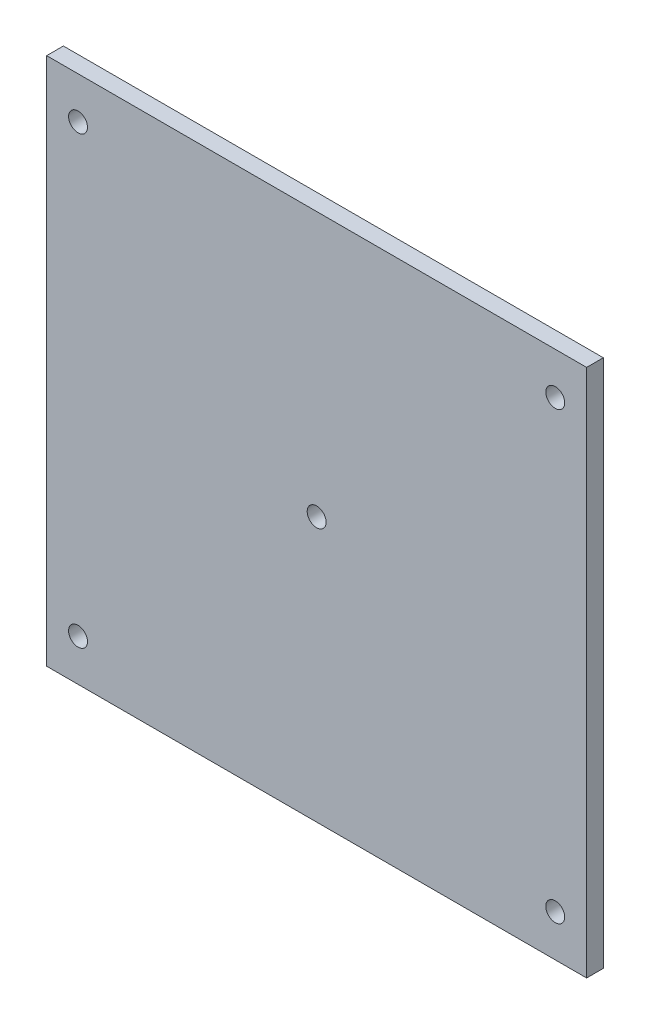
ISO-10303-21;
HEADER;
FILE_DESCRIPTION(('STEP AP214'),'2;1');
FILE_NAME('part.step','',(''),(''),'','','');
FILE_SCHEMA(('AUTOMOTIVE_DESIGN { 1 0 10303 214 1 1 1 1 }'));
ENDSEC;
DATA;
#1=APPLICATION_CONTEXT('core data for automotive mechanical design processes');
#2=APPLICATION_PROTOCOL_DEFINITION('international standard','automotive_design',2000,#1);
#3=PRODUCT_CONTEXT('',#1,'mechanical');
#4=PRODUCT('Part','Part','',(#3));
#5=PRODUCT_RELATED_PRODUCT_CATEGORY('part','',(#4));
#6=PRODUCT_DEFINITION_FORMATION('','',#4);
#7=PRODUCT_DEFINITION_CONTEXT('part definition',#1,'design');
#8=PRODUCT_DEFINITION('design','',#6,#7);
#9=PRODUCT_DEFINITION_SHAPE('','',#8);
#10=(LENGTH_UNIT() NAMED_UNIT(*) SI_UNIT(.MILLI.,.METRE.));
#11=(NAMED_UNIT(*) PLANE_ANGLE_UNIT() SI_UNIT($,.RADIAN.));
#12=(NAMED_UNIT(*) SI_UNIT($,.STERADIAN.) SOLID_ANGLE_UNIT());
#13=UNCERTAINTY_MEASURE_WITH_UNIT(LENGTH_MEASURE(1.E-05),#10,'distance_accuracy_value','');
#14=(GEOMETRIC_REPRESENTATION_CONTEXT(3) GLOBAL_UNCERTAINTY_ASSIGNED_CONTEXT((#13)) GLOBAL_UNIT_ASSIGNED_CONTEXT((#10,
#11,#12)) REPRESENTATION_CONTEXT('',''));
#15=CARTESIAN_POINT('',(0.,0.,0.));
#16=DIRECTION('',(0.,0.,1.));
#17=DIRECTION('',(1.,0.,0.));
#18=AXIS2_PLACEMENT_3D('',#15,#16,#17);
#19=CARTESIAN_POINT('',(0.,0.,3.));
#20=DIRECTION('',(1.,0.,0.));
#21=DIRECTION('',(0.,0.,-1.));
#22=AXIS2_PLACEMENT_3D('',#19,#20,#21);
#23=PLANE('',#22);
#24=DIRECTION('',(0.,-1.,0.));
#25=VECTOR('',#24,1.);
#26=CARTESIAN_POINT('',(0.,0.,0.));
#27=LINE('',#26,#25);
#28=CARTESIAN_POINT('',(0.,95.,0.));
#29=VERTEX_POINT('',#28);
#30=CARTESIAN_POINT('',(0.,0.,0.));
#31=VERTEX_POINT('',#30);
#32=EDGE_CURVE('E107',#29,#31,#27,.T.);
#33=ORIENTED_EDGE('',*,*,#32,.T.);
#34=DIRECTION('',(0.,0.,-1.));
#35=VECTOR('',#34,1.);
#36=CARTESIAN_POINT('',(0.,0.,3.));
#37=LINE('',#36,#35);
#38=CARTESIAN_POINT('',(0.,0.,3.));
#39=VERTEX_POINT('',#38);
#40=EDGE_CURVE('E11',#39,#31,#37,.T.);
#41=ORIENTED_EDGE('',*,*,#40,.F.);
#42=DIRECTION('',(0.,-1.,0.));
#43=VECTOR('',#42,1.);
#44=CARTESIAN_POINT('',(0.,0.,3.));
#45=LINE('',#44,#43);
#46=CARTESIAN_POINT('',(0.,95.,3.));
#47=VERTEX_POINT('',#46);
#48=EDGE_CURVE('E94',#47,#39,#45,.T.);
#49=ORIENTED_EDGE('',*,*,#48,.F.);
#50=DIRECTION('',(0.,0.,-1.));
#51=VECTOR('',#50,1.);
#52=CARTESIAN_POINT('',(0.,95.,3.));
#53=LINE('',#52,#51);
#54=EDGE_CURVE('E103',#47,#29,#53,.T.);
#55=ORIENTED_EDGE('',*,*,#54,.T.);
#56=EDGE_LOOP('',(#33,#41,#49,#55));
#57=FACE_BOUND('',#56,.T.);
#58=ADVANCED_FACE('F41',(#57),#23,.F.);
#59=CARTESIAN_POINT('',(0.,0.,3.));
#60=DIRECTION('',(0.,1.,0.));
#61=DIRECTION('',(0.,0.,1.));
#62=AXIS2_PLACEMENT_3D('',#59,#60,#61);
#63=PLANE('',#62);
#64=DIRECTION('',(1.,0.,0.));
#65=VECTOR('',#64,1.);
#66=CARTESIAN_POINT('',(0.,0.,0.));
#67=LINE('',#66,#65);
#68=CARTESIAN_POINT('',(97.,0.,0.));
#69=VERTEX_POINT('',#68);
#70=EDGE_CURVE('E98',#31,#69,#67,.T.);
#71=ORIENTED_EDGE('',*,*,#70,.T.);
#72=DIRECTION('',(0.,0.,-1.));
#73=VECTOR('',#72,1.);
#74=CARTESIAN_POINT('',(97.,0.,3.));
#75=LINE('',#74,#73);
#76=CARTESIAN_POINT('',(97.,0.,3.));
#77=VERTEX_POINT('',#76);
#78=EDGE_CURVE('E50',#77,#69,#75,.T.);
#79=ORIENTED_EDGE('',*,*,#78,.F.);
#80=DIRECTION('',(1.,0.,0.));
#81=VECTOR('',#80,1.);
#82=CARTESIAN_POINT('',(0.,0.,3.));
#83=LINE('',#82,#81);
#84=EDGE_CURVE('E89',#39,#77,#83,.T.);
#85=ORIENTED_EDGE('',*,*,#84,.F.);
#86=ORIENTED_EDGE('',*,*,#40,.T.);
#87=EDGE_LOOP('',(#71,#79,#85,#86));
#88=FACE_BOUND('',#87,.T.);
#89=ADVANCED_FACE('F97',(#88),#63,.F.);
#90=CARTESIAN_POINT('',(97.,0.,3.));
#91=DIRECTION('',(-1.,0.,0.));
#92=DIRECTION('',(0.,0.,1.));
#93=AXIS2_PLACEMENT_3D('',#90,#91,#92);
#94=PLANE('',#93);
#95=DIRECTION('',(0.,1.,0.));
#96=VECTOR('',#95,1.);
#97=CARTESIAN_POINT('',(97.,0.,0.));
#98=LINE('',#97,#96);
#99=CARTESIAN_POINT('',(97.,95.,0.));
#100=VERTEX_POINT('',#99);
#101=EDGE_CURVE('E76',#69,#100,#98,.T.);
#102=ORIENTED_EDGE('',*,*,#101,.T.);
#103=DIRECTION('',(0.,0.,-1.));
#104=VECTOR('',#103,1.);
#105=CARTESIAN_POINT('',(97.,95.,3.));
#106=LINE('',#105,#104);
#107=CARTESIAN_POINT('',(97.,95.,3.));
#108=VERTEX_POINT('',#107);
#109=EDGE_CURVE('E99',#108,#100,#106,.T.);
#110=ORIENTED_EDGE('',*,*,#109,.F.);
#111=DIRECTION('',(0.,1.,0.));
#112=VECTOR('',#111,1.);
#113=CARTESIAN_POINT('',(97.,0.,3.));
#114=LINE('',#113,#112);
#115=EDGE_CURVE('E92',#77,#108,#114,.T.);
#116=ORIENTED_EDGE('',*,*,#115,.F.);
#117=ORIENTED_EDGE('',*,*,#78,.T.);
#118=EDGE_LOOP('',(#102,#110,#116,#117));
#119=FACE_BOUND('',#118,.T.);
#120=ADVANCED_FACE('F101',(#119),#94,.F.);
#121=CARTESIAN_POINT('',(0.,95.,3.));
#122=DIRECTION('',(0.,-1.,0.));
#123=DIRECTION('',(0.,0.,-1.));
#124=AXIS2_PLACEMENT_3D('',#121,#122,#123);
#125=PLANE('',#124);
#126=DIRECTION('',(-1.,0.,0.));
#127=VECTOR('',#126,1.);
#128=CARTESIAN_POINT('',(0.,95.,0.));
#129=LINE('',#128,#127);
#130=EDGE_CURVE('E82',#100,#29,#129,.T.);
#131=ORIENTED_EDGE('',*,*,#130,.T.);
#132=ORIENTED_EDGE('',*,*,#54,.F.);
#133=DIRECTION('',(-1.,0.,0.));
#134=VECTOR('',#133,1.);
#135=CARTESIAN_POINT('',(0.,95.,3.));
#136=LINE('',#135,#134);
#137=EDGE_CURVE('E59',#108,#47,#136,.T.);
#138=ORIENTED_EDGE('',*,*,#137,.F.);
#139=ORIENTED_EDGE('',*,*,#109,.T.);
#140=EDGE_LOOP('',(#131,#132,#138,#139));
#141=FACE_BOUND('',#140,.T.);
#142=ADVANCED_FACE('F148',(#141),#125,.F.);
#143=CARTESIAN_POINT('',(0.,0.,3.));
#144=DIRECTION('',(0.,0.,-1.));
#145=DIRECTION('',(-1.,0.,0.));
#146=AXIS2_PLACEMENT_3D('',#143,#144,#145);
#147=PLANE('',#146);
#148=CARTESIAN_POINT('',(91.365,7.495,3.));
#149=DIRECTION('',(0.,0.,1.));
#150=DIRECTION('',(1.,0.,0.));
#151=AXIS2_PLACEMENT_3D('',#148,#149,#150);
#152=CIRCLE('',#151,1.69999999999999);
#153=CARTESIAN_POINT('',(93.065,7.495,3.));
#154=VERTEX_POINT('',#153);
#155=EDGE_CURVE('E240',#154,#154,#152,.T.);
#156=ORIENTED_EDGE('',*,*,#155,.F.);
#157=EDGE_LOOP('',(#156));
#158=FACE_BOUND('',#157,.T.);
#159=CARTESIAN_POINT('',(5.635,87.505,3.));
#160=DIRECTION('',(0.,0.,1.));
#161=DIRECTION('',(1.,0.,0.));
#162=AXIS2_PLACEMENT_3D('',#159,#160,#161);
#163=CIRCLE('',#162,1.7);
#164=CARTESIAN_POINT('',(7.335,87.505,3.));
#165=VERTEX_POINT('',#164);
#166=EDGE_CURVE('E238',#165,#165,#163,.T.);
#167=ORIENTED_EDGE('',*,*,#166,.F.);
#168=EDGE_LOOP('',(#167));
#169=FACE_BOUND('',#168,.T.);
#170=CARTESIAN_POINT('',(91.365,87.505,3.));
#171=DIRECTION('',(0.,0.,1.));
#172=DIRECTION('',(1.,0.,0.));
#173=AXIS2_PLACEMENT_3D('',#170,#171,#172);
#174=CIRCLE('',#173,1.69999999999999);
#175=CARTESIAN_POINT('',(93.065,87.505,3.));
#176=VERTEX_POINT('',#175);
#177=EDGE_CURVE('E241',#176,#176,#174,.T.);
#178=ORIENTED_EDGE('',*,*,#177,.F.);
#179=EDGE_LOOP('',(#178));
#180=FACE_BOUND('',#179,.T.);
#181=CARTESIAN_POINT('',(48.5,47.5,3.));
#182=DIRECTION('',(0.,0.,1.));
#183=DIRECTION('',(1.,0.,0.));
#184=AXIS2_PLACEMENT_3D('',#181,#182,#183);
#185=CIRCLE('',#184,1.7);
#186=CARTESIAN_POINT('',(50.2,47.5,3.));
#187=VERTEX_POINT('',#186);
#188=EDGE_CURVE('E246',#187,#187,#185,.T.);
#189=ORIENTED_EDGE('',*,*,#188,.F.);
#190=EDGE_LOOP('',(#189));
#191=FACE_BOUND('',#190,.T.);
#192=CARTESIAN_POINT('',(5.635,7.495,3.));
#193=DIRECTION('',(0.,0.,1.));
#194=DIRECTION('',(1.,0.,0.));
#195=AXIS2_PLACEMENT_3D('',#192,#193,#194);
#196=CIRCLE('',#195,1.7);
#197=CARTESIAN_POINT('',(7.335,7.495,3.));
#198=VERTEX_POINT('',#197);
#199=EDGE_CURVE('E119',#198,#198,#196,.T.);
#200=ORIENTED_EDGE('',*,*,#199,.F.);
#201=EDGE_LOOP('',(#200));
#202=FACE_BOUND('',#201,.T.);
#203=ORIENTED_EDGE('',*,*,#48,.T.);
#204=ORIENTED_EDGE('',*,*,#84,.T.);
#205=ORIENTED_EDGE('',*,*,#115,.T.);
#206=ORIENTED_EDGE('',*,*,#137,.T.);
#207=EDGE_LOOP('',(#203,#204,#205,#206));
#208=FACE_BOUND('',#207,.T.);
#209=ADVANCED_FACE('F90',(#158,#169,#180,#191,#202,#208),#147,.F.);
#210=CARTESIAN_POINT('',(0.,0.,0.));
#211=DIRECTION('',(0.,0.,-1.));
#212=DIRECTION('',(-1.,0.,0.));
#213=AXIS2_PLACEMENT_3D('',#210,#211,#212);
#214=PLANE('',#213);
#215=CARTESIAN_POINT('',(91.365,7.495,0.));
#216=DIRECTION('',(0.,0.,-1.));
#217=DIRECTION('',(-1.,0.,0.));
#218=AXIS2_PLACEMENT_3D('',#215,#216,#217);
#219=CIRCLE('',#218,1.69999999999999);
#220=CARTESIAN_POINT('',(93.065,7.495,0.));
#221=VERTEX_POINT('',#220);
#222=EDGE_CURVE('E44',#221,#221,#219,.T.);
#223=ORIENTED_EDGE('',*,*,#222,.F.);
#224=EDGE_LOOP('',(#223));
#225=FACE_BOUND('',#224,.T.);
#226=CARTESIAN_POINT('',(5.635,87.505,0.));
#227=DIRECTION('',(0.,0.,-1.));
#228=DIRECTION('',(-1.,0.,0.));
#229=AXIS2_PLACEMENT_3D('',#226,#227,#228);
#230=CIRCLE('',#229,1.7);
#231=CARTESIAN_POINT('',(7.335,87.505,0.));
#232=VERTEX_POINT('',#231);
#233=EDGE_CURVE('E124',#232,#232,#230,.T.);
#234=ORIENTED_EDGE('',*,*,#233,.F.);
#235=EDGE_LOOP('',(#234));
#236=FACE_BOUND('',#235,.T.);
#237=CARTESIAN_POINT('',(91.365,87.505,0.));
#238=DIRECTION('',(0.,0.,-1.));
#239=DIRECTION('',(-1.,0.,0.));
#240=AXIS2_PLACEMENT_3D('',#237,#238,#239);
#241=CIRCLE('',#240,1.69999999999999);
#242=CARTESIAN_POINT('',(93.065,87.505,0.));
#243=VERTEX_POINT('',#242);
#244=EDGE_CURVE('E122',#243,#243,#241,.T.);
#245=ORIENTED_EDGE('',*,*,#244,.F.);
#246=EDGE_LOOP('',(#245));
#247=FACE_BOUND('',#246,.T.);
#248=CARTESIAN_POINT('',(48.5,47.5,0.));
#249=DIRECTION('',(0.,0.,-1.));
#250=DIRECTION('',(-1.,0.,0.));
#251=AXIS2_PLACEMENT_3D('',#248,#249,#250);
#252=CIRCLE('',#251,1.7);
#253=CARTESIAN_POINT('',(50.2,47.5,0.));
#254=VERTEX_POINT('',#253);
#255=EDGE_CURVE('E118',#254,#254,#252,.T.);
#256=ORIENTED_EDGE('',*,*,#255,.F.);
#257=EDGE_LOOP('',(#256));
#258=FACE_BOUND('',#257,.T.);
#259=CARTESIAN_POINT('',(5.635,7.495,0.));
#260=DIRECTION('',(0.,0.,-1.));
#261=DIRECTION('',(-1.,0.,0.));
#262=AXIS2_PLACEMENT_3D('',#259,#260,#261);
#263=CIRCLE('',#262,1.7);
#264=CARTESIAN_POINT('',(7.335,7.495,0.));
#265=VERTEX_POINT('',#264);
#266=EDGE_CURVE('E115',#265,#265,#263,.T.);
#267=ORIENTED_EDGE('',*,*,#266,.F.);
#268=EDGE_LOOP('',(#267));
#269=FACE_BOUND('',#268,.T.);
#270=ORIENTED_EDGE('',*,*,#32,.F.);
#271=ORIENTED_EDGE('',*,*,#130,.F.);
#272=ORIENTED_EDGE('',*,*,#101,.F.);
#273=ORIENTED_EDGE('',*,*,#70,.F.);
#274=EDGE_LOOP('',(#270,#271,#272,#273));
#275=FACE_BOUND('',#274,.T.);
#276=ADVANCED_FACE('F134',(#225,#236,#247,#258,#269,#275),#214,.T.);
#277=CARTESIAN_POINT('',(5.635,7.495,-1.2E-05));
#278=DIRECTION('',(0.,0.,1.));
#279=DIRECTION('',(1.,0.,0.));
#280=AXIS2_PLACEMENT_3D('',#277,#278,#279);
#281=CYLINDRICAL_SURFACE('',#280,1.7);
#282=CARTESIAN_POINT('',(7.335,7.495,0.));
#283=CARTESIAN_POINT('',(7.335,7.495,0.03125));
#284=CARTESIAN_POINT('',(7.335,7.495,0.0625));
#285=CARTESIAN_POINT('',(7.335,7.495,0.125));
#286=CARTESIAN_POINT('',(7.335,7.495,0.15625));
#287=CARTESIAN_POINT('',(7.335,7.495,0.21875));
#288=CARTESIAN_POINT('',(7.335,7.495,0.25));
#289=CARTESIAN_POINT('',(7.335,7.495,0.3125));
#290=CARTESIAN_POINT('',(7.335,7.495,0.34375));
#291=CARTESIAN_POINT('',(7.335,7.495,0.40625));
#292=CARTESIAN_POINT('',(7.335,7.495,0.4375));
#293=CARTESIAN_POINT('',(7.335,7.495,0.5));
#294=CARTESIAN_POINT('',(7.335,7.495,0.53125));
#295=CARTESIAN_POINT('',(7.335,7.495,0.59375));
#296=CARTESIAN_POINT('',(7.335,7.495,0.625));
#297=CARTESIAN_POINT('',(7.335,7.495,0.6875));
#298=CARTESIAN_POINT('',(7.335,7.495,0.71875));
#299=CARTESIAN_POINT('',(7.335,7.495,0.78125));
#300=CARTESIAN_POINT('',(7.335,7.495,0.8125));
#301=CARTESIAN_POINT('',(7.335,7.495,0.875));
#302=CARTESIAN_POINT('',(7.335,7.495,0.90625));
#303=CARTESIAN_POINT('',(7.335,7.495,0.96875));
#304=CARTESIAN_POINT('',(7.335,7.495,1.));
#305=CARTESIAN_POINT('',(7.335,7.495,1.0625));
#306=CARTESIAN_POINT('',(7.335,7.495,1.09375));
#307=CARTESIAN_POINT('',(7.335,7.495,1.15625));
#308=CARTESIAN_POINT('',(7.335,7.495,1.1875));
#309=CARTESIAN_POINT('',(7.335,7.495,1.25));
#310=CARTESIAN_POINT('',(7.335,7.495,1.28125));
#311=CARTESIAN_POINT('',(7.335,7.495,1.34375));
#312=CARTESIAN_POINT('',(7.335,7.495,1.375));
#313=CARTESIAN_POINT('',(7.335,7.495,1.4375));
#314=CARTESIAN_POINT('',(7.335,7.495,1.46875));
#315=CARTESIAN_POINT('',(7.335,7.495,1.53125));
#316=CARTESIAN_POINT('',(7.335,7.495,1.5625));
#317=CARTESIAN_POINT('',(7.335,7.495,1.625));
#318=CARTESIAN_POINT('',(7.335,7.495,1.65625));
#319=CARTESIAN_POINT('',(7.335,7.495,1.71875));
#320=CARTESIAN_POINT('',(7.335,7.495,1.75));
#321=CARTESIAN_POINT('',(7.335,7.495,1.8125));
#322=CARTESIAN_POINT('',(7.335,7.495,1.84375));
#323=CARTESIAN_POINT('',(7.335,7.495,1.90625));
#324=CARTESIAN_POINT('',(7.335,7.495,1.9375));
#325=CARTESIAN_POINT('',(7.335,7.495,2.));
#326=CARTESIAN_POINT('',(7.335,7.495,2.03125));
#327=CARTESIAN_POINT('',(7.335,7.495,2.09375));
#328=CARTESIAN_POINT('',(7.335,7.495,2.125));
#329=CARTESIAN_POINT('',(7.335,7.495,2.1875));
#330=CARTESIAN_POINT('',(7.335,7.495,2.21875));
#331=CARTESIAN_POINT('',(7.335,7.495,2.28125));
#332=CARTESIAN_POINT('',(7.335,7.495,2.3125));
#333=CARTESIAN_POINT('',(7.335,7.495,2.375));
#334=CARTESIAN_POINT('',(7.335,7.495,2.40625));
#335=CARTESIAN_POINT('',(7.335,7.495,2.46875));
#336=CARTESIAN_POINT('',(7.335,7.495,2.5));
#337=CARTESIAN_POINT('',(7.335,7.495,2.5625));
#338=CARTESIAN_POINT('',(7.335,7.495,2.59375));
#339=CARTESIAN_POINT('',(7.335,7.495,2.65625));
#340=CARTESIAN_POINT('',(7.335,7.495,2.6875));
#341=CARTESIAN_POINT('',(7.335,7.495,2.75));
#342=CARTESIAN_POINT('',(7.335,7.495,2.78125));
#343=CARTESIAN_POINT('',(7.335,7.495,2.84375));
#344=CARTESIAN_POINT('',(7.335,7.495,2.875));
#345=CARTESIAN_POINT('',(7.335,7.495,2.9375));
#346=CARTESIAN_POINT('',(7.335,7.495,2.96875));
#347=CARTESIAN_POINT('',(7.335,7.495,3.));
#348=B_SPLINE_CURVE_WITH_KNOTS('',3,(#282,#283,#284,#285,#286,#287,#288,#289,#290,#291,#292,
#293,#294,#295,#296,#297,#298,#299,#300,#301,#302,#303,#304,#305,#306,#307,#308,#309,#310,#311,
#312,#313,#314,#315,#316,#317,#318,#319,#320,#321,#322,#323,#324,#325,#326,#327,#328,#329,#330,
#331,#332,#333,#334,#335,#336,#337,#338,#339,#340,#341,#342,#343,#344,#345,#346,#347),
.UNSPECIFIED.,.F.,.F.,(4,2,2,2,2,2,2,2,2,2,2,2,2,2,2,2,2,2,2,2,2,2,2,2,2,2,2,2,2,2,2,2,4),(0.,
0.09375,0.1875,0.28125,0.375,0.46875,0.5625,0.65625,0.75,0.84375,0.9375,1.03125,1.125,1.21875,
1.3125,1.40625,1.5,1.59375,1.6875,1.78125,1.875,1.96875,2.0625,2.15625,2.25,2.34375,2.4375,
2.53125,2.625,2.71875,2.8125,2.90625,3.),.UNSPECIFIED.);
#349=EDGE_CURVE('BSEAM137',#265,#198,#348,.T.);
#350=ORIENTED_EDGE('',*,*,#266,.T.);
#351=ORIENTED_EDGE('',*,*,#199,.T.);
#352=ORIENTED_EDGE('',*,*,#349,.T.);
#353=ORIENTED_EDGE('',*,*,#349,.F.);
#354=EDGE_LOOP('',(#350,#352,#351,#353));
#355=FACE_BOUND('',#354,.T.);
#356=ADVANCED_FACE('F137',(#355),#281,.F.);
#357=CARTESIAN_POINT('',(48.5,47.5,-1.2E-05));
#358=DIRECTION('',(0.,0.,1.));
#359=DIRECTION('',(1.,0.,0.));
#360=AXIS2_PLACEMENT_3D('',#357,#358,#359);
#361=CYLINDRICAL_SURFACE('',#360,1.7);
#362=CARTESIAN_POINT('',(50.2,47.5,0.));
#363=CARTESIAN_POINT('',(50.2,47.5,0.03125));
#364=CARTESIAN_POINT('',(50.2,47.5,0.0625));
#365=CARTESIAN_POINT('',(50.2,47.5,0.125));
#366=CARTESIAN_POINT('',(50.2,47.5,0.15625));
#367=CARTESIAN_POINT('',(50.2,47.5,0.21875));
#368=CARTESIAN_POINT('',(50.2,47.5,0.25));
#369=CARTESIAN_POINT('',(50.2,47.5,0.3125));
#370=CARTESIAN_POINT('',(50.2,47.5,0.34375));
#371=CARTESIAN_POINT('',(50.2,47.5,0.40625));
#372=CARTESIAN_POINT('',(50.2,47.5,0.4375));
#373=CARTESIAN_POINT('',(50.2,47.5,0.5));
#374=CARTESIAN_POINT('',(50.2,47.5,0.53125));
#375=CARTESIAN_POINT('',(50.2,47.5,0.59375));
#376=CARTESIAN_POINT('',(50.2,47.5,0.625));
#377=CARTESIAN_POINT('',(50.2,47.5,0.6875));
#378=CARTESIAN_POINT('',(50.2,47.5,0.71875));
#379=CARTESIAN_POINT('',(50.2,47.5,0.78125));
#380=CARTESIAN_POINT('',(50.2,47.5,0.8125));
#381=CARTESIAN_POINT('',(50.2,47.5,0.875));
#382=CARTESIAN_POINT('',(50.2,47.5,0.90625));
#383=CARTESIAN_POINT('',(50.2,47.5,0.96875));
#384=CARTESIAN_POINT('',(50.2,47.5,1.));
#385=CARTESIAN_POINT('',(50.2,47.5,1.0625));
#386=CARTESIAN_POINT('',(50.2,47.5,1.09375));
#387=CARTESIAN_POINT('',(50.2,47.5,1.15625));
#388=CARTESIAN_POINT('',(50.2,47.5,1.1875));
#389=CARTESIAN_POINT('',(50.2,47.5,1.25));
#390=CARTESIAN_POINT('',(50.2,47.5,1.28125));
#391=CARTESIAN_POINT('',(50.2,47.5,1.34375));
#392=CARTESIAN_POINT('',(50.2,47.5,1.375));
#393=CARTESIAN_POINT('',(50.2,47.5,1.4375));
#394=CARTESIAN_POINT('',(50.2,47.5,1.46875));
#395=CARTESIAN_POINT('',(50.2,47.5,1.53125));
#396=CARTESIAN_POINT('',(50.2,47.5,1.5625));
#397=CARTESIAN_POINT('',(50.2,47.5,1.625));
#398=CARTESIAN_POINT('',(50.2,47.5,1.65625));
#399=CARTESIAN_POINT('',(50.2,47.5,1.71875));
#400=CARTESIAN_POINT('',(50.2,47.5,1.75));
#401=CARTESIAN_POINT('',(50.2,47.5,1.8125));
#402=CARTESIAN_POINT('',(50.2,47.5,1.84375));
#403=CARTESIAN_POINT('',(50.2,47.5,1.90625));
#404=CARTESIAN_POINT('',(50.2,47.5,1.9375));
#405=CARTESIAN_POINT('',(50.2,47.5,2.));
#406=CARTESIAN_POINT('',(50.2,47.5,2.03125));
#407=CARTESIAN_POINT('',(50.2,47.5,2.09375));
#408=CARTESIAN_POINT('',(50.2,47.5,2.125));
#409=CARTESIAN_POINT('',(50.2,47.5,2.1875));
#410=CARTESIAN_POINT('',(50.2,47.5,2.21875));
#411=CARTESIAN_POINT('',(50.2,47.5,2.28125));
#412=CARTESIAN_POINT('',(50.2,47.5,2.3125));
#413=CARTESIAN_POINT('',(50.2,47.5,2.375));
#414=CARTESIAN_POINT('',(50.2,47.5,2.40625));
#415=CARTESIAN_POINT('',(50.2,47.5,2.46875));
#416=CARTESIAN_POINT('',(50.2,47.5,2.5));
#417=CARTESIAN_POINT('',(50.2,47.5,2.5625));
#418=CARTESIAN_POINT('',(50.2,47.5,2.59375));
#419=CARTESIAN_POINT('',(50.2,47.5,2.65625));
#420=CARTESIAN_POINT('',(50.2,47.5,2.6875));
#421=CARTESIAN_POINT('',(50.2,47.5,2.75));
#422=CARTESIAN_POINT('',(50.2,47.5,2.78125));
#423=CARTESIAN_POINT('',(50.2,47.5,2.84375));
#424=CARTESIAN_POINT('',(50.2,47.5,2.875));
#425=CARTESIAN_POINT('',(50.2,47.5,2.9375));
#426=CARTESIAN_POINT('',(50.2,47.5,2.96875));
#427=CARTESIAN_POINT('',(50.2,47.5,3.));
#428=B_SPLINE_CURVE_WITH_KNOTS('',3,(#362,#363,#364,#365,#366,#367,#368,#369,#370,#371,#372,
#373,#374,#375,#376,#377,#378,#379,#380,#381,#382,#383,#384,#385,#386,#387,#388,#389,#390,#391,
#392,#393,#394,#395,#396,#397,#398,#399,#400,#401,#402,#403,#404,#405,#406,#407,#408,#409,#410,
#411,#412,#413,#414,#415,#416,#417,#418,#419,#420,#421,#422,#423,#424,#425,#426,#427),
.UNSPECIFIED.,.F.,.F.,(4,2,2,2,2,2,2,2,2,2,2,2,2,2,2,2,2,2,2,2,2,2,2,2,2,2,2,2,2,2,2,2,4),(0.,
0.09375,0.1875,0.28125,0.375,0.46875,0.5625,0.65625,0.75,0.84375,0.9375,1.03125,1.125,1.21875,
1.3125,1.40625,1.5,1.59375,1.6875,1.78125,1.875,1.96875,2.0625,2.15625,2.25,2.34375,2.4375,
2.53125,2.625,2.71875,2.8125,2.90625,3.),.UNSPECIFIED.);
#429=EDGE_CURVE('BSEAM195',#254,#187,#428,.T.);
#430=ORIENTED_EDGE('',*,*,#255,.T.);
#431=ORIENTED_EDGE('',*,*,#188,.T.);
#432=ORIENTED_EDGE('',*,*,#429,.T.);
#433=ORIENTED_EDGE('',*,*,#429,.F.);
#434=EDGE_LOOP('',(#430,#432,#431,#433));
#435=FACE_BOUND('',#434,.T.);
#436=ADVANCED_FACE('F195',(#435),#361,.F.);
#437=CARTESIAN_POINT('',(91.365,87.505,-1.2E-05));
#438=DIRECTION('',(0.,0.,1.));
#439=DIRECTION('',(1.,0.,0.));
#440=AXIS2_PLACEMENT_3D('',#437,#438,#439);
#441=CYLINDRICAL_SURFACE('',#440,1.69999999999999);
#442=CARTESIAN_POINT('',(93.065,87.505,0.));
#443=CARTESIAN_POINT('',(93.065,87.505,0.03125));
#444=CARTESIAN_POINT('',(93.065,87.505,0.0625));
#445=CARTESIAN_POINT('',(93.065,87.505,0.125));
#446=CARTESIAN_POINT('',(93.065,87.505,0.15625));
#447=CARTESIAN_POINT('',(93.065,87.505,0.21875));
#448=CARTESIAN_POINT('',(93.065,87.505,0.25));
#449=CARTESIAN_POINT('',(93.065,87.505,0.3125));
#450=CARTESIAN_POINT('',(93.065,87.505,0.34375));
#451=CARTESIAN_POINT('',(93.065,87.505,0.40625));
#452=CARTESIAN_POINT('',(93.065,87.505,0.4375));
#453=CARTESIAN_POINT('',(93.065,87.505,0.5));
#454=CARTESIAN_POINT('',(93.065,87.505,0.53125));
#455=CARTESIAN_POINT('',(93.065,87.505,0.59375));
#456=CARTESIAN_POINT('',(93.065,87.505,0.625));
#457=CARTESIAN_POINT('',(93.065,87.505,0.6875));
#458=CARTESIAN_POINT('',(93.065,87.505,0.71875));
#459=CARTESIAN_POINT('',(93.065,87.505,0.78125));
#460=CARTESIAN_POINT('',(93.065,87.505,0.8125));
#461=CARTESIAN_POINT('',(93.065,87.505,0.875));
#462=CARTESIAN_POINT('',(93.065,87.505,0.90625));
#463=CARTESIAN_POINT('',(93.065,87.505,0.96875));
#464=CARTESIAN_POINT('',(93.065,87.505,1.));
#465=CARTESIAN_POINT('',(93.065,87.505,1.0625));
#466=CARTESIAN_POINT('',(93.065,87.505,1.09375));
#467=CARTESIAN_POINT('',(93.065,87.505,1.15625));
#468=CARTESIAN_POINT('',(93.065,87.505,1.1875));
#469=CARTESIAN_POINT('',(93.065,87.505,1.25));
#470=CARTESIAN_POINT('',(93.065,87.505,1.28125));
#471=CARTESIAN_POINT('',(93.065,87.505,1.34375));
#472=CARTESIAN_POINT('',(93.065,87.505,1.375));
#473=CARTESIAN_POINT('',(93.065,87.505,1.4375));
#474=CARTESIAN_POINT('',(93.065,87.505,1.46875));
#475=CARTESIAN_POINT('',(93.065,87.505,1.53125));
#476=CARTESIAN_POINT('',(93.065,87.505,1.5625));
#477=CARTESIAN_POINT('',(93.065,87.505,1.625));
#478=CARTESIAN_POINT('',(93.065,87.505,1.65625));
#479=CARTESIAN_POINT('',(93.065,87.505,1.71875));
#480=CARTESIAN_POINT('',(93.065,87.505,1.75));
#481=CARTESIAN_POINT('',(93.065,87.505,1.8125));
#482=CARTESIAN_POINT('',(93.065,87.505,1.84375));
#483=CARTESIAN_POINT('',(93.065,87.505,1.90625));
#484=CARTESIAN_POINT('',(93.065,87.505,1.9375));
#485=CARTESIAN_POINT('',(93.065,87.505,2.));
#486=CARTESIAN_POINT('',(93.065,87.505,2.03125));
#487=CARTESIAN_POINT('',(93.065,87.505,2.09375));
#488=CARTESIAN_POINT('',(93.065,87.505,2.125));
#489=CARTESIAN_POINT('',(93.065,87.505,2.1875));
#490=CARTESIAN_POINT('',(93.065,87.505,2.21875));
#491=CARTESIAN_POINT('',(93.065,87.505,2.28125));
#492=CARTESIAN_POINT('',(93.065,87.505,2.3125));
#493=CARTESIAN_POINT('',(93.065,87.505,2.375));
#494=CARTESIAN_POINT('',(93.065,87.505,2.40625));
#495=CARTESIAN_POINT('',(93.065,87.505,2.46875));
#496=CARTESIAN_POINT('',(93.065,87.505,2.5));
#497=CARTESIAN_POINT('',(93.065,87.505,2.5625));
#498=CARTESIAN_POINT('',(93.065,87.505,2.59375));
#499=CARTESIAN_POINT('',(93.065,87.505,2.65625));
#500=CARTESIAN_POINT('',(93.065,87.505,2.6875));
#501=CARTESIAN_POINT('',(93.065,87.505,2.75));
#502=CARTESIAN_POINT('',(93.065,87.505,2.78125));
#503=CARTESIAN_POINT('',(93.065,87.505,2.84375));
#504=CARTESIAN_POINT('',(93.065,87.505,2.875));
#505=CARTESIAN_POINT('',(93.065,87.505,2.9375));
#506=CARTESIAN_POINT('',(93.065,87.505,2.96875));
#507=CARTESIAN_POINT('',(93.065,87.505,3.));
#508=B_SPLINE_CURVE_WITH_KNOTS('',3,(#442,#443,#444,#445,#446,#447,#448,#449,#450,#451,#452,
#453,#454,#455,#456,#457,#458,#459,#460,#461,#462,#463,#464,#465,#466,#467,#468,#469,#470,#471,
#472,#473,#474,#475,#476,#477,#478,#479,#480,#481,#482,#483,#484,#485,#486,#487,#488,#489,#490,
#491,#492,#493,#494,#495,#496,#497,#498,#499,#500,#501,#502,#503,#504,#505,#506,#507),
.UNSPECIFIED.,.F.,.F.,(4,2,2,2,2,2,2,2,2,2,2,2,2,2,2,2,2,2,2,2,2,2,2,2,2,2,2,2,2,2,2,2,4),(0.,
0.09375,0.1875,0.28125,0.375,0.46875,0.5625,0.65625,0.75,0.84375,0.9375,1.03125,1.125,1.21875,
1.3125,1.40625,1.5,1.59375,1.6875,1.78125,1.875,1.96875,2.0625,2.15625,2.25,2.34375,2.4375,
2.53125,2.625,2.71875,2.8125,2.90625,3.),.UNSPECIFIED.);
#509=EDGE_CURVE('BSEAM205',#243,#176,#508,.T.);
#510=ORIENTED_EDGE('',*,*,#244,.T.);
#511=ORIENTED_EDGE('',*,*,#177,.T.);
#512=ORIENTED_EDGE('',*,*,#509,.T.);
#513=ORIENTED_EDGE('',*,*,#509,.F.);
#514=EDGE_LOOP('',(#510,#512,#511,#513));
#515=FACE_BOUND('',#514,.T.);
#516=ADVANCED_FACE('F205',(#515),#441,.F.);
#517=CARTESIAN_POINT('',(5.635,87.505,-1.2E-05));
#518=DIRECTION('',(0.,0.,1.));
#519=DIRECTION('',(1.,0.,0.));
#520=AXIS2_PLACEMENT_3D('',#517,#518,#519);
#521=CYLINDRICAL_SURFACE('',#520,1.7);
#522=CARTESIAN_POINT('',(7.335,87.505,0.));
#523=CARTESIAN_POINT('',(7.335,87.505,0.03125));
#524=CARTESIAN_POINT('',(7.335,87.505,0.0625));
#525=CARTESIAN_POINT('',(7.335,87.505,0.125));
#526=CARTESIAN_POINT('',(7.335,87.505,0.15625));
#527=CARTESIAN_POINT('',(7.335,87.505,0.21875));
#528=CARTESIAN_POINT('',(7.335,87.505,0.25));
#529=CARTESIAN_POINT('',(7.335,87.505,0.3125));
#530=CARTESIAN_POINT('',(7.335,87.505,0.34375));
#531=CARTESIAN_POINT('',(7.335,87.505,0.40625));
#532=CARTESIAN_POINT('',(7.335,87.505,0.4375));
#533=CARTESIAN_POINT('',(7.335,87.505,0.5));
#534=CARTESIAN_POINT('',(7.335,87.505,0.53125));
#535=CARTESIAN_POINT('',(7.335,87.505,0.59375));
#536=CARTESIAN_POINT('',(7.335,87.505,0.625));
#537=CARTESIAN_POINT('',(7.335,87.505,0.6875));
#538=CARTESIAN_POINT('',(7.335,87.505,0.71875));
#539=CARTESIAN_POINT('',(7.335,87.505,0.78125));
#540=CARTESIAN_POINT('',(7.335,87.505,0.8125));
#541=CARTESIAN_POINT('',(7.335,87.505,0.875));
#542=CARTESIAN_POINT('',(7.335,87.505,0.90625));
#543=CARTESIAN_POINT('',(7.335,87.505,0.96875));
#544=CARTESIAN_POINT('',(7.335,87.505,1.));
#545=CARTESIAN_POINT('',(7.335,87.505,1.0625));
#546=CARTESIAN_POINT('',(7.335,87.505,1.09375));
#547=CARTESIAN_POINT('',(7.335,87.505,1.15625));
#548=CARTESIAN_POINT('',(7.335,87.505,1.1875));
#549=CARTESIAN_POINT('',(7.335,87.505,1.25));
#550=CARTESIAN_POINT('',(7.335,87.505,1.28125));
#551=CARTESIAN_POINT('',(7.335,87.505,1.34375));
#552=CARTESIAN_POINT('',(7.335,87.505,1.375));
#553=CARTESIAN_POINT('',(7.335,87.505,1.4375));
#554=CARTESIAN_POINT('',(7.335,87.505,1.46875));
#555=CARTESIAN_POINT('',(7.335,87.505,1.53125));
#556=CARTESIAN_POINT('',(7.335,87.505,1.5625));
#557=CARTESIAN_POINT('',(7.335,87.505,1.625));
#558=CARTESIAN_POINT('',(7.335,87.505,1.65625));
#559=CARTESIAN_POINT('',(7.335,87.505,1.71875));
#560=CARTESIAN_POINT('',(7.335,87.505,1.75));
#561=CARTESIAN_POINT('',(7.335,87.505,1.8125));
#562=CARTESIAN_POINT('',(7.335,87.505,1.84375));
#563=CARTESIAN_POINT('',(7.335,87.505,1.90625));
#564=CARTESIAN_POINT('',(7.335,87.505,1.9375));
#565=CARTESIAN_POINT('',(7.335,87.505,2.));
#566=CARTESIAN_POINT('',(7.335,87.505,2.03125));
#567=CARTESIAN_POINT('',(7.335,87.505,2.09375));
#568=CARTESIAN_POINT('',(7.335,87.505,2.125));
#569=CARTESIAN_POINT('',(7.335,87.505,2.1875));
#570=CARTESIAN_POINT('',(7.335,87.505,2.21875));
#571=CARTESIAN_POINT('',(7.335,87.505,2.28125));
#572=CARTESIAN_POINT('',(7.335,87.505,2.3125));
#573=CARTESIAN_POINT('',(7.335,87.505,2.375));
#574=CARTESIAN_POINT('',(7.335,87.505,2.40625));
#575=CARTESIAN_POINT('',(7.335,87.505,2.46875));
#576=CARTESIAN_POINT('',(7.335,87.505,2.5));
#577=CARTESIAN_POINT('',(7.335,87.505,2.5625));
#578=CARTESIAN_POINT('',(7.335,87.505,2.59375));
#579=CARTESIAN_POINT('',(7.335,87.505,2.65625));
#580=CARTESIAN_POINT('',(7.335,87.505,2.6875));
#581=CARTESIAN_POINT('',(7.335,87.505,2.75));
#582=CARTESIAN_POINT('',(7.335,87.505,2.78125));
#583=CARTESIAN_POINT('',(7.335,87.505,2.84375));
#584=CARTESIAN_POINT('',(7.335,87.505,2.875));
#585=CARTESIAN_POINT('',(7.335,87.505,2.9375));
#586=CARTESIAN_POINT('',(7.335,87.505,2.96875));
#587=CARTESIAN_POINT('',(7.335,87.505,3.));
#588=B_SPLINE_CURVE_WITH_KNOTS('',3,(#522,#523,#524,#525,#526,#527,#528,#529,#530,#531,#532,
#533,#534,#535,#536,#537,#538,#539,#540,#541,#542,#543,#544,#545,#546,#547,#548,#549,#550,#551,
#552,#553,#554,#555,#556,#557,#558,#559,#560,#561,#562,#563,#564,#565,#566,#567,#568,#569,#570,
#571,#572,#573,#574,#575,#576,#577,#578,#579,#580,#581,#582,#583,#584,#585,#586,#587),
.UNSPECIFIED.,.F.,.F.,(4,2,2,2,2,2,2,2,2,2,2,2,2,2,2,2,2,2,2,2,2,2,2,2,2,2,2,2,2,2,2,2,4),(0.,
0.09375,0.1875,0.28125,0.375,0.46875,0.5625,0.65625,0.75,0.84375,0.9375,1.03125,1.125,1.21875,
1.3125,1.40625,1.5,1.59375,1.6875,1.78125,1.875,1.96875,2.0625,2.15625,2.25,2.34375,2.4375,
2.53125,2.625,2.71875,2.8125,2.90625,3.),.UNSPECIFIED.);
#589=EDGE_CURVE('BSEAM215',#232,#165,#588,.T.);
#590=ORIENTED_EDGE('',*,*,#233,.T.);
#591=ORIENTED_EDGE('',*,*,#166,.T.);
#592=ORIENTED_EDGE('',*,*,#589,.T.);
#593=ORIENTED_EDGE('',*,*,#589,.F.);
#594=EDGE_LOOP('',(#590,#592,#591,#593));
#595=FACE_BOUND('',#594,.T.);
#596=ADVANCED_FACE('F215',(#595),#521,.F.);
#597=CARTESIAN_POINT('',(91.365,7.495,-1.2E-05));
#598=DIRECTION('',(0.,0.,1.));
#599=DIRECTION('',(1.,0.,0.));
#600=AXIS2_PLACEMENT_3D('',#597,#598,#599);
#601=CYLINDRICAL_SURFACE('',#600,1.69999999999999);
#602=CARTESIAN_POINT('',(93.065,7.495,0.));
#603=CARTESIAN_POINT('',(93.065,7.495,0.03125));
#604=CARTESIAN_POINT('',(93.065,7.495,0.0625));
#605=CARTESIAN_POINT('',(93.065,7.495,0.125));
#606=CARTESIAN_POINT('',(93.065,7.495,0.15625));
#607=CARTESIAN_POINT('',(93.065,7.495,0.21875));
#608=CARTESIAN_POINT('',(93.065,7.495,0.25));
#609=CARTESIAN_POINT('',(93.065,7.495,0.3125));
#610=CARTESIAN_POINT('',(93.065,7.495,0.34375));
#611=CARTESIAN_POINT('',(93.065,7.495,0.40625));
#612=CARTESIAN_POINT('',(93.065,7.495,0.4375));
#613=CARTESIAN_POINT('',(93.065,7.495,0.5));
#614=CARTESIAN_POINT('',(93.065,7.495,0.53125));
#615=CARTESIAN_POINT('',(93.065,7.495,0.59375));
#616=CARTESIAN_POINT('',(93.065,7.495,0.625));
#617=CARTESIAN_POINT('',(93.065,7.495,0.6875));
#618=CARTESIAN_POINT('',(93.065,7.495,0.71875));
#619=CARTESIAN_POINT('',(93.065,7.495,0.78125));
#620=CARTESIAN_POINT('',(93.065,7.495,0.8125));
#621=CARTESIAN_POINT('',(93.065,7.495,0.875));
#622=CARTESIAN_POINT('',(93.065,7.495,0.90625));
#623=CARTESIAN_POINT('',(93.065,7.495,0.96875));
#624=CARTESIAN_POINT('',(93.065,7.495,1.));
#625=CARTESIAN_POINT('',(93.065,7.495,1.0625));
#626=CARTESIAN_POINT('',(93.065,7.495,1.09375));
#627=CARTESIAN_POINT('',(93.065,7.495,1.15625));
#628=CARTESIAN_POINT('',(93.065,7.495,1.1875));
#629=CARTESIAN_POINT('',(93.065,7.495,1.25));
#630=CARTESIAN_POINT('',(93.065,7.495,1.28125));
#631=CARTESIAN_POINT('',(93.065,7.495,1.34375));
#632=CARTESIAN_POINT('',(93.065,7.495,1.375));
#633=CARTESIAN_POINT('',(93.065,7.495,1.4375));
#634=CARTESIAN_POINT('',(93.065,7.495,1.46875));
#635=CARTESIAN_POINT('',(93.065,7.495,1.53125));
#636=CARTESIAN_POINT('',(93.065,7.495,1.5625));
#637=CARTESIAN_POINT('',(93.065,7.495,1.625));
#638=CARTESIAN_POINT('',(93.065,7.495,1.65625));
#639=CARTESIAN_POINT('',(93.065,7.495,1.71875));
#640=CARTESIAN_POINT('',(93.065,7.495,1.75));
#641=CARTESIAN_POINT('',(93.065,7.495,1.8125));
#642=CARTESIAN_POINT('',(93.065,7.495,1.84375));
#643=CARTESIAN_POINT('',(93.065,7.495,1.90625));
#644=CARTESIAN_POINT('',(93.065,7.495,1.9375));
#645=CARTESIAN_POINT('',(93.065,7.495,2.));
#646=CARTESIAN_POINT('',(93.065,7.495,2.03125));
#647=CARTESIAN_POINT('',(93.065,7.495,2.09375));
#648=CARTESIAN_POINT('',(93.065,7.495,2.125));
#649=CARTESIAN_POINT('',(93.065,7.495,2.1875));
#650=CARTESIAN_POINT('',(93.065,7.495,2.21875));
#651=CARTESIAN_POINT('',(93.065,7.495,2.28125));
#652=CARTESIAN_POINT('',(93.065,7.495,2.3125));
#653=CARTESIAN_POINT('',(93.065,7.495,2.375));
#654=CARTESIAN_POINT('',(93.065,7.495,2.40625));
#655=CARTESIAN_POINT('',(93.065,7.495,2.46875));
#656=CARTESIAN_POINT('',(93.065,7.495,2.5));
#657=CARTESIAN_POINT('',(93.065,7.495,2.5625));
#658=CARTESIAN_POINT('',(93.065,7.495,2.59375));
#659=CARTESIAN_POINT('',(93.065,7.495,2.65625));
#660=CARTESIAN_POINT('',(93.065,7.495,2.6875));
#661=CARTESIAN_POINT('',(93.065,7.495,2.75));
#662=CARTESIAN_POINT('',(93.065,7.495,2.78125));
#663=CARTESIAN_POINT('',(93.065,7.495,2.84375));
#664=CARTESIAN_POINT('',(93.065,7.495,2.875));
#665=CARTESIAN_POINT('',(93.065,7.495,2.9375));
#666=CARTESIAN_POINT('',(93.065,7.495,2.96875));
#667=CARTESIAN_POINT('',(93.065,7.495,3.));
#668=B_SPLINE_CURVE_WITH_KNOTS('',3,(#602,#603,#604,#605,#606,#607,#608,#609,#610,#611,#612,
#613,#614,#615,#616,#617,#618,#619,#620,#621,#622,#623,#624,#625,#626,#627,#628,#629,#630,#631,
#632,#633,#634,#635,#636,#637,#638,#639,#640,#641,#642,#643,#644,#645,#646,#647,#648,#649,#650,
#651,#652,#653,#654,#655,#656,#657,#658,#659,#660,#661,#662,#663,#664,#665,#666,#667),
.UNSPECIFIED.,.F.,.F.,(4,2,2,2,2,2,2,2,2,2,2,2,2,2,2,2,2,2,2,2,2,2,2,2,2,2,2,2,2,2,2,2,4),(0.,
0.09375,0.1875,0.28125,0.375,0.46875,0.5625,0.65625,0.75,0.84375,0.9375,1.03125,1.125,1.21875,
1.3125,1.40625,1.5,1.59375,1.6875,1.78125,1.875,1.96875,2.0625,2.15625,2.25,2.34375,2.4375,
2.53125,2.625,2.71875,2.8125,2.90625,3.),.UNSPECIFIED.);
#669=EDGE_CURVE('BSEAM131',#221,#154,#668,.T.);
#670=ORIENTED_EDGE('',*,*,#222,.T.);
#671=ORIENTED_EDGE('',*,*,#155,.T.);
#672=ORIENTED_EDGE('',*,*,#669,.T.);
#673=ORIENTED_EDGE('',*,*,#669,.F.);
#674=EDGE_LOOP('',(#670,#672,#671,#673));
#675=FACE_BOUND('',#674,.T.);
#676=ADVANCED_FACE('F131',(#675),#601,.F.);
#677=CLOSED_SHELL('',(#58,#89,#120,#142,#209,#276,#356,#436,#516,#596,#676));
#678=MANIFOLD_SOLID_BREP('B2',#677);
#679=ADVANCED_BREP_SHAPE_REPRESENTATION('',(#18,#678),#14);
#680=SHAPE_DEFINITION_REPRESENTATION(#9,#679);
ENDSEC;
END-ISO-10303-21;
